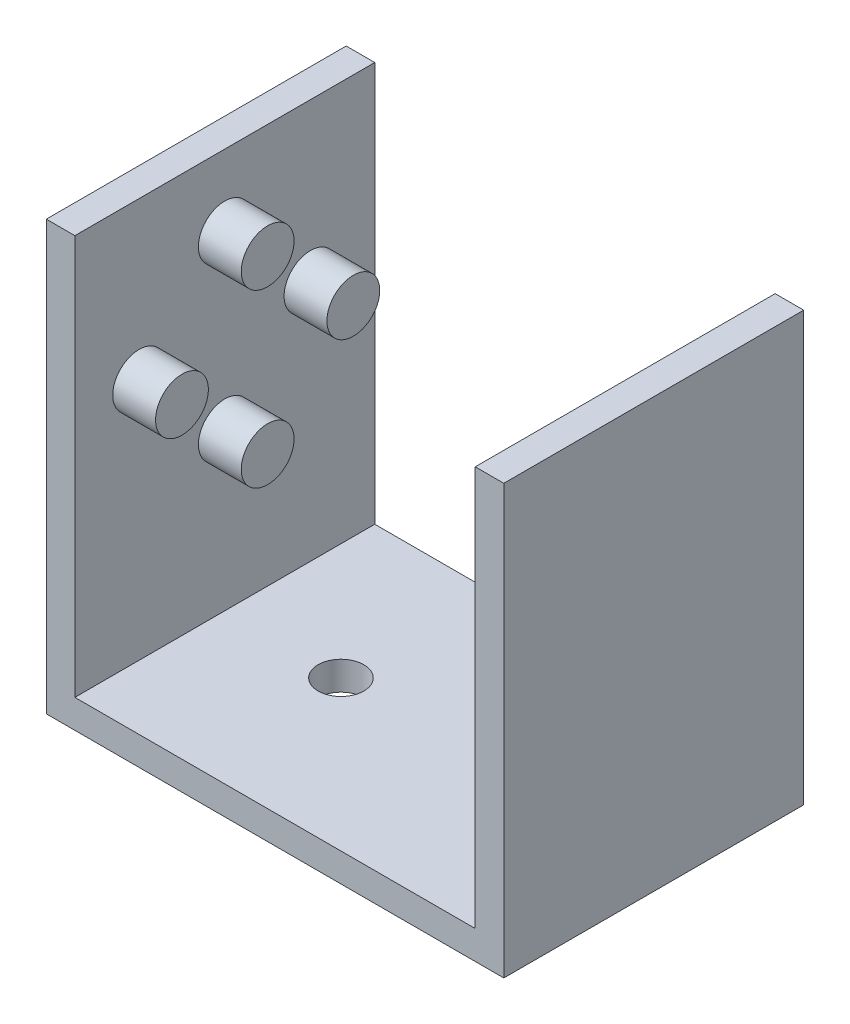
ISO-10303-21;
HEADER;
FILE_DESCRIPTION(('STEP AP214'),'2;1');
FILE_NAME('part.step','',(''),(''),'','','');
FILE_SCHEMA(('AUTOMOTIVE_DESIGN { 1 0 10303 214 1 1 1 1 }'));
ENDSEC;
DATA;
#1=APPLICATION_CONTEXT('core data for automotive mechanical design processes');
#2=APPLICATION_PROTOCOL_DEFINITION('international standard','automotive_design',2000,#1);
#3=PRODUCT_CONTEXT('',#1,'mechanical');
#4=PRODUCT('Part','Part','',(#3));
#5=PRODUCT_RELATED_PRODUCT_CATEGORY('part','',(#4));
#6=PRODUCT_DEFINITION_FORMATION('','',#4);
#7=PRODUCT_DEFINITION_CONTEXT('part definition',#1,'design');
#8=PRODUCT_DEFINITION('design','',#6,#7);
#9=PRODUCT_DEFINITION_SHAPE('','',#8);
#10=(LENGTH_UNIT() NAMED_UNIT(*) SI_UNIT(.MILLI.,.METRE.));
#11=(NAMED_UNIT(*) PLANE_ANGLE_UNIT() SI_UNIT($,.RADIAN.));
#12=(NAMED_UNIT(*) SI_UNIT($,.STERADIAN.) SOLID_ANGLE_UNIT());
#13=UNCERTAINTY_MEASURE_WITH_UNIT(LENGTH_MEASURE(1.E-05),#10,'distance_accuracy_value','');
#14=(GEOMETRIC_REPRESENTATION_CONTEXT(3) GLOBAL_UNCERTAINTY_ASSIGNED_CONTEXT((#13)) GLOBAL_UNIT_ASSIGNED_CONTEXT((#10,
#11,#12)) REPRESENTATION_CONTEXT('',''));
#15=CARTESIAN_POINT('',(0.,0.,0.));
#16=DIRECTION('',(0.,0.,1.));
#17=DIRECTION('',(1.,0.,0.));
#18=AXIS2_PLACEMENT_3D('',#15,#16,#17);
#19=CARTESIAN_POINT('',(9.32069693245083,-19.2948215654397,-10.5));
#20=DIRECTION('',(1.,0.,0.));
#21=DIRECTION('',(0.,1.,0.));
#22=AXIS2_PLACEMENT_3D('',#19,#20,#21);
#23=CYLINDRICAL_SURFACE('',#22,1.85);
#24=CARTESIAN_POINT('',(9.32069693245083,-19.2948215654397,-10.5));
#25=DIRECTION('',(-1.,0.,0.));
#26=DIRECTION('',(0.,-1.,0.));
#27=AXIS2_PLACEMENT_3D('',#24,#25,#26);
#28=CIRCLE('',#27,1.85);
#29=CARTESIAN_POINT('',(9.32069693245083,-21.1448215654397,-10.5));
#30=VERTEX_POINT('',#29);
#31=EDGE_CURVE('E11',#30,#30,#28,.T.);
#32=ORIENTED_EDGE('',*,*,#31,.F.);
#33=EDGE_LOOP('',(#32));
#34=FACE_BOUND('',#33,.T.);
#35=CARTESIAN_POINT('',(12.3206969324508,-19.2948215654397,-10.5));
#36=DIRECTION('',(-1.,0.,0.));
#37=DIRECTION('',(0.,-1.,0.));
#38=AXIS2_PLACEMENT_3D('',#35,#36,#37);
#39=CIRCLE('',#38,1.85);
#40=CARTESIAN_POINT('',(12.3206969324508,-21.1448215654397,-10.5));
#41=VERTEX_POINT('',#40);
#42=EDGE_CURVE('E50',#41,#41,#39,.T.);
#43=ORIENTED_EDGE('',*,*,#42,.T.);
#44=EDGE_LOOP('',(#43));
#45=FACE_BOUND('',#44,.T.);
#46=ADVANCED_FACE('F47',(#34,#45),#23,.T.);
#47=CARTESIAN_POINT('',(9.32069693245083,-19.2948215654397,-10.5));
#48=DIRECTION('',(-1.,0.,0.));
#49=DIRECTION('',(0.,-1.,0.));
#50=AXIS2_PLACEMENT_3D('',#47,#48,#49);
#51=PLANE('',#50);
#52=ORIENTED_EDGE('',*,*,#31,.T.);
#53=EDGE_LOOP('',(#52));
#54=FACE_BOUND('',#53,.T.);
#55=ADVANCED_FACE('F62',(#54),#51,.T.);
#56=CARTESIAN_POINT('',(12.3206969324508,-19.2948215654397,-10.5));
#57=DIRECTION('',(-1.,0.,0.));
#58=DIRECTION('',(0.,-1.,0.));
#59=AXIS2_PLACEMENT_3D('',#56,#57,#58);
#60=PLANE('',#59);
#61=ORIENTED_EDGE('',*,*,#42,.F.);
#62=EDGE_LOOP('',(#61));
#63=FACE_BOUND('',#62,.T.);
#64=ADVANCED_FACE('F60',(#63),#60,.F.);
#65=CLOSED_SHELL('',(#46,#55,#64));
#66=MANIFOLD_SOLID_BREP('B2',#65);
#67=CARTESIAN_POINT('',(12.3206969324508,-36.2948215654397,-21.));
#68=DIRECTION('',(0.,1.,0.));
#69=DIRECTION('',(0.,0.,1.));
#70=AXIS2_PLACEMENT_3D('',#67,#68,#69);
#71=PLANE('',#70);
#72=CARTESIAN_POINT('',(7.41858126283971,-36.2948215654397,-10.5));
#73=DIRECTION('',(0.,1.,0.));
#74=DIRECTION('',(0.,0.,1.));
#75=AXIS2_PLACEMENT_3D('',#72,#73,#74);
#76=CIRCLE('',#75,1.6);
#77=CARTESIAN_POINT('',(7.41858126283971,-36.2948215654397,-8.9));
#78=VERTEX_POINT('',#77);
#79=EDGE_CURVE('E297',#78,#78,#76,.T.);
#80=ORIENTED_EDGE('',*,*,#79,.F.);
#81=EDGE_LOOP('',(#80));
#82=FACE_BOUND('',#81,.T.);
#83=CARTESIAN_POINT('',(-7.58141873716028,-36.2948215654397,-10.5));
#84=DIRECTION('',(0.,1.,0.));
#85=DIRECTION('',(0.,0.,1.));
#86=AXIS2_PLACEMENT_3D('',#83,#84,#85);
#87=CIRCLE('',#86,1.6);
#88=CARTESIAN_POINT('',(-7.58141873716028,-36.2948215654397,-8.9));
#89=VERTEX_POINT('',#88);
#90=EDGE_CURVE('E301',#89,#89,#87,.T.);
#91=ORIENTED_EDGE('',*,*,#90,.F.);
#92=EDGE_LOOP('',(#91));
#93=FACE_BOUND('',#92,.T.);
#94=DIRECTION('',(-1.,0.,0.));
#95=VECTOR('',#94,1.);
#96=CARTESIAN_POINT('',(12.3206969324508,-36.2948215654397,0.));
#97=LINE('',#96,#95);
#98=CARTESIAN_POINT('',(12.3206969324508,-36.2948215654397,0.));
#99=VERTEX_POINT('',#98);
#100=CARTESIAN_POINT('',(-15.7146854023076,-36.2948215654397,0.));
#101=VERTEX_POINT('',#100);
#102=EDGE_CURVE('E191',#99,#101,#97,.T.);
#103=ORIENTED_EDGE('',*,*,#102,.F.);
#104=DIRECTION('',(0.,0.,1.));
#105=VECTOR('',#104,1.);
#106=CARTESIAN_POINT('',(12.3206969324508,-36.2948215654397,-21.));
#107=LINE('',#106,#105);
#108=CARTESIAN_POINT('',(12.3206969324508,-36.2948215654397,-21.));
#109=VERTEX_POINT('',#108);
#110=EDGE_CURVE('E45',#109,#99,#107,.T.);
#111=ORIENTED_EDGE('',*,*,#110,.F.);
#112=DIRECTION('',(-1.,0.,0.));
#113=VECTOR('',#112,1.);
#114=CARTESIAN_POINT('',(12.3206969324508,-36.2948215654397,-21.));
#115=LINE('',#114,#113);
#116=CARTESIAN_POINT('',(-15.7146854023076,-36.2948215654397,-21.));
#117=VERTEX_POINT('',#116);
#118=EDGE_CURVE('E212',#109,#117,#115,.T.);
#119=ORIENTED_EDGE('',*,*,#118,.T.);
#120=DIRECTION('',(0.,0.,1.));
#121=VECTOR('',#120,1.);
#122=CARTESIAN_POINT('',(-15.7146854023076,-36.2948215654397,-21.));
#123=LINE('',#122,#121);
#124=EDGE_CURVE('E97',#117,#101,#123,.T.);
#125=ORIENTED_EDGE('',*,*,#124,.T.);
#126=EDGE_LOOP('',(#103,#111,#119,#125));
#127=FACE_BOUND('',#126,.T.);
#128=ADVANCED_FACE('F94',(#82,#93,#127),#71,.T.);
#129=CARTESIAN_POINT('',(12.3206969324508,-8.29482156543967,-21.));
#130=DIRECTION('',(-1.,0.,0.));
#131=DIRECTION('',(0.,-1.,0.));
#132=AXIS2_PLACEMENT_3D('',#129,#130,#131);
#133=PLANE('',#132);
#134=DIRECTION('',(0.,-1.,0.));
#135=VECTOR('',#134,1.);
#136=CARTESIAN_POINT('',(12.3206969324508,-8.29482156543967,0.));
#137=LINE('',#136,#135);
#138=CARTESIAN_POINT('',(12.3206969324508,-8.29482156543967,0.));
#139=VERTEX_POINT('',#138);
#140=EDGE_CURVE('E210',#139,#99,#137,.T.);
#141=ORIENTED_EDGE('',*,*,#140,.F.);
#142=DIRECTION('',(0.,0.,1.));
#143=VECTOR('',#142,1.);
#144=CARTESIAN_POINT('',(12.3206969324508,-8.29482156543967,-21.));
#145=LINE('',#144,#143);
#146=CARTESIAN_POINT('',(12.3206969324508,-8.29482156543967,-21.));
#147=VERTEX_POINT('',#146);
#148=EDGE_CURVE('E103',#147,#139,#145,.T.);
#149=ORIENTED_EDGE('',*,*,#148,.F.);
#150=DIRECTION('',(0.,-1.,0.));
#151=VECTOR('',#150,1.);
#152=CARTESIAN_POINT('',(12.3206969324508,-8.29482156543967,-21.));
#153=LINE('',#152,#151);
#154=EDGE_CURVE('E181',#147,#109,#153,.T.);
#155=ORIENTED_EDGE('',*,*,#154,.T.);
#156=ORIENTED_EDGE('',*,*,#110,.T.);
#157=EDGE_LOOP('',(#141,#149,#155,#156));
#158=FACE_BOUND('',#157,.T.);
#159=ADVANCED_FACE('F224',(#158),#133,.T.);
#160=CARTESIAN_POINT('',(12.3206969324508,-8.29482156543967,-21.));
#161=DIRECTION('',(0.,1.,0.));
#162=DIRECTION('',(0.,0.,1.));
#163=AXIS2_PLACEMENT_3D('',#160,#161,#162);
#164=PLANE('',#163);
#165=DIRECTION('',(-1.,0.,0.));
#166=VECTOR('',#165,1.);
#167=CARTESIAN_POINT('',(12.3206969324508,-8.29482156543967,0.));
#168=LINE('',#167,#166);
#169=CARTESIAN_POINT('',(14.3206969324508,-8.29482156543967,0.));
#170=VERTEX_POINT('',#169);
#171=EDGE_CURVE('E168',#170,#139,#168,.T.);
#172=ORIENTED_EDGE('',*,*,#171,.F.);
#173=DIRECTION('',(0.,0.,1.));
#174=VECTOR('',#173,1.);
#175=CARTESIAN_POINT('',(14.3206969324508,-8.29482156543967,-21.));
#176=LINE('',#175,#174);
#177=CARTESIAN_POINT('',(14.3206969324508,-8.29482156543967,-21.));
#178=VERTEX_POINT('',#177);
#179=EDGE_CURVE('E163',#178,#170,#176,.T.);
#180=ORIENTED_EDGE('',*,*,#179,.F.);
#181=DIRECTION('',(-1.,0.,0.));
#182=VECTOR('',#181,1.);
#183=CARTESIAN_POINT('',(12.3206969324508,-8.29482156543967,-21.));
#184=LINE('',#183,#182);
#185=EDGE_CURVE('E166',#178,#147,#184,.T.);
#186=ORIENTED_EDGE('',*,*,#185,.T.);
#187=ORIENTED_EDGE('',*,*,#148,.T.);
#188=EDGE_LOOP('',(#172,#180,#186,#187));
#189=FACE_BOUND('',#188,.T.);
#190=ADVANCED_FACE('F165',(#189),#164,.T.);
#191=CARTESIAN_POINT('',(14.3206969324508,-8.29482156543967,-21.));
#192=DIRECTION('',(1.,0.,0.));
#193=DIRECTION('',(0.,1.,0.));
#194=AXIS2_PLACEMENT_3D('',#191,#192,#193);
#195=PLANE('',#194);
#196=DIRECTION('',(0.,1.,0.));
#197=VECTOR('',#196,1.);
#198=CARTESIAN_POINT('',(14.3206969324508,-8.29482156543967,0.));
#199=LINE('',#198,#197);
#200=CARTESIAN_POINT('',(14.3206969324508,-38.2948215654397,0.));
#201=VERTEX_POINT('',#200);
#202=EDGE_CURVE('E207',#201,#170,#199,.T.);
#203=ORIENTED_EDGE('',*,*,#202,.F.);
#204=DIRECTION('',(0.,0.,1.));
#205=VECTOR('',#204,1.);
#206=CARTESIAN_POINT('',(14.3206969324508,-38.2948215654397,-21.));
#207=LINE('',#206,#205);
#208=CARTESIAN_POINT('',(14.3206969324508,-38.2948215654397,-21.));
#209=VERTEX_POINT('',#208);
#210=EDGE_CURVE('E173',#209,#201,#207,.T.);
#211=ORIENTED_EDGE('',*,*,#210,.F.);
#212=DIRECTION('',(0.,1.,0.));
#213=VECTOR('',#212,1.);
#214=CARTESIAN_POINT('',(14.3206969324508,-8.29482156543967,-21.));
#215=LINE('',#214,#213);
#216=EDGE_CURVE('E179',#209,#178,#215,.T.);
#217=ORIENTED_EDGE('',*,*,#216,.T.);
#218=ORIENTED_EDGE('',*,*,#179,.T.);
#219=EDGE_LOOP('',(#203,#211,#217,#218));
#220=FACE_BOUND('',#219,.T.);
#221=ADVANCED_FACE('F183',(#220),#195,.T.);
#222=CARTESIAN_POINT('',(14.3206969324508,-38.2948215654397,-21.));
#223=DIRECTION('',(0.,-1.,0.));
#224=DIRECTION('',(0.,0.,-1.));
#225=AXIS2_PLACEMENT_3D('',#222,#223,#224);
#226=PLANE('',#225);
#227=CARTESIAN_POINT('',(7.41858126283971,-38.2948215654397,-10.5));
#228=DIRECTION('',(0.,-1.,0.));
#229=DIRECTION('',(0.,0.,-1.));
#230=AXIS2_PLACEMENT_3D('',#227,#228,#229);
#231=CIRCLE('',#230,1.6);
#232=CARTESIAN_POINT('',(7.41858126283971,-38.2948215654397,-12.1));
#233=VERTEX_POINT('',#232);
#234=EDGE_CURVE('E304',#233,#233,#231,.T.);
#235=ORIENTED_EDGE('',*,*,#234,.F.);
#236=EDGE_LOOP('',(#235));
#237=FACE_BOUND('',#236,.T.);
#238=CARTESIAN_POINT('',(-7.58141873716028,-38.2948215654397,-10.5));
#239=DIRECTION('',(0.,-1.,0.));
#240=DIRECTION('',(0.,0.,1.));
#241=AXIS2_PLACEMENT_3D('',#238,#239,#240);
#242=CIRCLE('',#241,1.6);
#243=CARTESIAN_POINT('',(-7.58141873716028,-38.2948215654397,-8.9));
#244=VERTEX_POINT('',#243);
#245=EDGE_CURVE('E305',#244,#244,#242,.T.);
#246=ORIENTED_EDGE('',*,*,#245,.F.);
#247=EDGE_LOOP('',(#246));
#248=FACE_BOUND('',#247,.T.);
#249=DIRECTION('',(1.,0.,0.));
#250=VECTOR('',#249,1.);
#251=CARTESIAN_POINT('',(14.3206969324508,-38.2948215654397,0.));
#252=LINE('',#251,#250);
#253=CARTESIAN_POINT('',(-17.7146854023076,-38.2948215654397,0.));
#254=VERTEX_POINT('',#253);
#255=EDGE_CURVE('E204',#254,#201,#252,.T.);
#256=ORIENTED_EDGE('',*,*,#255,.F.);
#257=DIRECTION('',(0.,0.,1.));
#258=VECTOR('',#257,1.);
#259=CARTESIAN_POINT('',(-17.7146854023076,-38.2948215654397,-21.));
#260=LINE('',#259,#258);
#261=CARTESIAN_POINT('',(-17.7146854023076,-38.2948215654397,-21.));
#262=VERTEX_POINT('',#261);
#263=EDGE_CURVE('E216',#262,#254,#260,.T.);
#264=ORIENTED_EDGE('',*,*,#263,.F.);
#265=DIRECTION('',(1.,0.,0.));
#266=VECTOR('',#265,1.);
#267=CARTESIAN_POINT('',(14.3206969324508,-38.2948215654397,-21.));
#268=LINE('',#267,#266);
#269=EDGE_CURVE('E184',#262,#209,#268,.T.);
#270=ORIENTED_EDGE('',*,*,#269,.T.);
#271=ORIENTED_EDGE('',*,*,#210,.T.);
#272=EDGE_LOOP('',(#256,#264,#270,#271));
#273=FACE_BOUND('',#272,.T.);
#274=ADVANCED_FACE('F238',(#237,#248,#273),#226,.T.);
#275=CARTESIAN_POINT('',(-17.7146854023076,-38.2948215654397,-21.));
#276=DIRECTION('',(-1.,0.,0.));
#277=DIRECTION('',(0.,0.,1.));
#278=AXIS2_PLACEMENT_3D('',#275,#276,#277);
#279=PLANE('',#278);
#280=DIRECTION('',(0.,-1.,0.));
#281=VECTOR('',#280,1.);
#282=CARTESIAN_POINT('',(-17.7146854023076,-38.2948215654397,0.));
#283=LINE('',#282,#281);
#284=CARTESIAN_POINT('',(-17.7146854023076,-8.29482156543968,0.));
#285=VERTEX_POINT('',#284);
#286=EDGE_CURVE('E201',#285,#254,#283,.T.);
#287=ORIENTED_EDGE('',*,*,#286,.F.);
#288=DIRECTION('',(0.,0.,1.));
#289=VECTOR('',#288,1.);
#290=CARTESIAN_POINT('',(-17.7146854023076,-8.29482156543968,-21.));
#291=LINE('',#290,#289);
#292=CARTESIAN_POINT('',(-17.7146854023076,-8.29482156543968,-21.));
#293=VERTEX_POINT('',#292);
#294=EDGE_CURVE('E218',#293,#285,#291,.T.);
#295=ORIENTED_EDGE('',*,*,#294,.F.);
#296=DIRECTION('',(0.,-1.,0.));
#297=VECTOR('',#296,1.);
#298=CARTESIAN_POINT('',(-17.7146854023076,-38.2948215654397,-21.));
#299=LINE('',#298,#297);
#300=EDGE_CURVE('E186',#293,#262,#299,.T.);
#301=ORIENTED_EDGE('',*,*,#300,.T.);
#302=ORIENTED_EDGE('',*,*,#263,.T.);
#303=EDGE_LOOP('',(#287,#295,#301,#302));
#304=FACE_BOUND('',#303,.T.);
#305=ADVANCED_FACE('F241',(#304),#279,.T.);
#306=CARTESIAN_POINT('',(-17.7146854023076,-8.29482156543968,-21.));
#307=DIRECTION('',(0.,1.,0.));
#308=DIRECTION('',(-1.,0.,0.));
#309=AXIS2_PLACEMENT_3D('',#306,#307,#308);
#310=PLANE('',#309);
#311=DIRECTION('',(-1.,0.,0.));
#312=VECTOR('',#311,1.);
#313=CARTESIAN_POINT('',(-17.7146854023076,-8.29482156543968,0.));
#314=LINE('',#313,#312);
#315=CARTESIAN_POINT('',(-15.7146854023076,-8.29482156543967,0.));
#316=VERTEX_POINT('',#315);
#317=EDGE_CURVE('E198',#316,#285,#314,.T.);
#318=ORIENTED_EDGE('',*,*,#317,.F.);
#319=DIRECTION('',(0.,0.,1.));
#320=VECTOR('',#319,1.);
#321=CARTESIAN_POINT('',(-15.7146854023076,-8.29482156543967,-21.));
#322=LINE('',#321,#320);
#323=CARTESIAN_POINT('',(-15.7146854023076,-8.29482156543967,-21.));
#324=VERTEX_POINT('',#323);
#325=EDGE_CURVE('E219',#324,#316,#322,.T.);
#326=ORIENTED_EDGE('',*,*,#325,.F.);
#327=DIRECTION('',(-1.,0.,0.));
#328=VECTOR('',#327,1.);
#329=CARTESIAN_POINT('',(-17.7146854023076,-8.29482156543968,-21.));
#330=LINE('',#329,#328);
#331=EDGE_CURVE('E280',#324,#293,#330,.T.);
#332=ORIENTED_EDGE('',*,*,#331,.T.);
#333=ORIENTED_EDGE('',*,*,#294,.T.);
#334=EDGE_LOOP('',(#318,#326,#332,#333));
#335=FACE_BOUND('',#334,.T.);
#336=ADVANCED_FACE('F245',(#335),#310,.T.);
#337=CARTESIAN_POINT('',(-15.7146854023076,-36.2948215654397,-21.));
#338=DIRECTION('',(1.,0.,0.));
#339=DIRECTION('',(0.,1.,0.));
#340=AXIS2_PLACEMENT_3D('',#337,#338,#339);
#341=PLANE('',#340);
#342=CARTESIAN_POINT('',(-15.7146854023076,-13.2948215654397,-10.5));
#343=DIRECTION('',(1.,0.,0.));
#344=DIRECTION('',(0.,0.,-1.));
#345=AXIS2_PLACEMENT_3D('',#342,#343,#344);
#346=CIRCLE('',#345,1.85000000000006);
#347=CARTESIAN_POINT('',(-15.7146854023076,-13.2948215654397,-12.3500000000001));
#348=VERTEX_POINT('',#347);
#349=EDGE_CURVE('E257',#348,#348,#346,.T.);
#350=ORIENTED_EDGE('',*,*,#349,.F.);
#351=EDGE_LOOP('',(#350));
#352=FACE_BOUND('',#351,.T.);
#353=CARTESIAN_POINT('',(-15.7146854023076,-19.2948215654397,-4.5));
#354=DIRECTION('',(1.,0.,0.));
#355=DIRECTION('',(0.,0.,-1.));
#356=AXIS2_PLACEMENT_3D('',#353,#354,#355);
#357=CIRCLE('',#356,1.84999999999997);
#358=CARTESIAN_POINT('',(-15.7146854023076,-19.2948215654397,-6.34999999999997));
#359=VERTEX_POINT('',#358);
#360=EDGE_CURVE('E261',#359,#359,#357,.T.);
#361=ORIENTED_EDGE('',*,*,#360,.F.);
#362=EDGE_LOOP('',(#361));
#363=FACE_BOUND('',#362,.T.);
#364=CARTESIAN_POINT('',(-15.7146854023076,-19.2948215654397,-16.5));
#365=DIRECTION('',(1.,0.,0.));
#366=DIRECTION('',(0.,0.,-1.));
#367=AXIS2_PLACEMENT_3D('',#364,#365,#366);
#368=CIRCLE('',#367,1.85000000000005);
#369=CARTESIAN_POINT('',(-15.7146854023076,-19.2948215654397,-18.3500000000001));
#370=VERTEX_POINT('',#369);
#371=EDGE_CURVE('E265',#370,#370,#368,.T.);
#372=ORIENTED_EDGE('',*,*,#371,.F.);
#373=EDGE_LOOP('',(#372));
#374=FACE_BOUND('',#373,.T.);
#375=CARTESIAN_POINT('',(-15.7146854023076,-25.2948215654397,-10.5));
#376=DIRECTION('',(1.,0.,0.));
#377=DIRECTION('',(0.,0.,-1.));
#378=AXIS2_PLACEMENT_3D('',#375,#376,#377);
#379=CIRCLE('',#378,1.85);
#380=CARTESIAN_POINT('',(-15.7146854023076,-25.2948215654397,-12.35));
#381=VERTEX_POINT('',#380);
#382=EDGE_CURVE('E268',#381,#381,#379,.T.);
#383=ORIENTED_EDGE('',*,*,#382,.F.);
#384=EDGE_LOOP('',(#383));
#385=FACE_BOUND('',#384,.T.);
#386=DIRECTION('',(0.,1.,0.));
#387=VECTOR('',#386,1.);
#388=CARTESIAN_POINT('',(-15.7146854023076,-36.2948215654397,0.));
#389=LINE('',#388,#387);
#390=EDGE_CURVE('E194',#101,#316,#389,.T.);
#391=ORIENTED_EDGE('',*,*,#390,.F.);
#392=ORIENTED_EDGE('',*,*,#124,.F.);
#393=DIRECTION('',(0.,1.,0.));
#394=VECTOR('',#393,1.);
#395=CARTESIAN_POINT('',(-15.7146854023076,-36.2948215654397,-21.));
#396=LINE('',#395,#394);
#397=EDGE_CURVE('E278',#117,#324,#396,.T.);
#398=ORIENTED_EDGE('',*,*,#397,.T.);
#399=ORIENTED_EDGE('',*,*,#325,.T.);
#400=EDGE_LOOP('',(#391,#392,#398,#399));
#401=FACE_BOUND('',#400,.T.);
#402=ADVANCED_FACE('F221',(#352,#363,#374,#385,#401),#341,.T.);
#403=CARTESIAN_POINT('',(0.,0.,-21.));
#404=DIRECTION('',(0.,0.,-1.));
#405=DIRECTION('',(-1.,0.,0.));
#406=AXIS2_PLACEMENT_3D('',#403,#404,#405);
#407=PLANE('',#406);
#408=ORIENTED_EDGE('',*,*,#118,.F.);
#409=ORIENTED_EDGE('',*,*,#154,.F.);
#410=ORIENTED_EDGE('',*,*,#185,.F.);
#411=ORIENTED_EDGE('',*,*,#216,.F.);
#412=ORIENTED_EDGE('',*,*,#269,.F.);
#413=ORIENTED_EDGE('',*,*,#300,.F.);
#414=ORIENTED_EDGE('',*,*,#331,.F.);
#415=ORIENTED_EDGE('',*,*,#397,.F.);
#416=EDGE_LOOP('',(#408,#409,#410,#411,#412,#413,#414,#415));
#417=FACE_BOUND('',#416,.T.);
#418=ADVANCED_FACE('F177',(#417),#407,.T.);
#419=CARTESIAN_POINT('',(0.,0.,0.));
#420=DIRECTION('',(0.,0.,-1.));
#421=DIRECTION('',(-1.,0.,0.));
#422=AXIS2_PLACEMENT_3D('',#419,#420,#421);
#423=PLANE('',#422);
#424=ORIENTED_EDGE('',*,*,#102,.T.);
#425=ORIENTED_EDGE('',*,*,#390,.T.);
#426=ORIENTED_EDGE('',*,*,#317,.T.);
#427=ORIENTED_EDGE('',*,*,#286,.T.);
#428=ORIENTED_EDGE('',*,*,#255,.T.);
#429=ORIENTED_EDGE('',*,*,#202,.T.);
#430=ORIENTED_EDGE('',*,*,#171,.T.);
#431=ORIENTED_EDGE('',*,*,#140,.T.);
#432=EDGE_LOOP('',(#424,#425,#426,#427,#428,#429,#430,#431));
#433=FACE_BOUND('',#432,.T.);
#434=ADVANCED_FACE('F223',(#433),#423,.F.);
#435=CARTESIAN_POINT('',(-12.7146854023076,-25.2948215654397,-10.5));
#436=DIRECTION('',(-1.,0.,0.));
#437=DIRECTION('',(0.,0.,1.));
#438=AXIS2_PLACEMENT_3D('',#435,#436,#437);
#439=CYLINDRICAL_SURFACE('',#438,1.85);
#440=CARTESIAN_POINT('',(-12.7146854023076,-25.2948215654397,-10.5));
#441=DIRECTION('',(1.,0.,0.));
#442=DIRECTION('',(0.,0.,-1.));
#443=AXIS2_PLACEMENT_3D('',#440,#441,#442);
#444=CIRCLE('',#443,1.85);
#445=CARTESIAN_POINT('',(-12.7146854023076,-25.2948215654397,-12.35));
#446=VERTEX_POINT('',#445);
#447=EDGE_CURVE('E195',#446,#446,#444,.T.);
#448=ORIENTED_EDGE('',*,*,#447,.F.);
#449=EDGE_LOOP('',(#448));
#450=FACE_BOUND('',#449,.T.);
#451=ORIENTED_EDGE('',*,*,#382,.T.);
#452=EDGE_LOOP('',(#451));
#453=FACE_BOUND('',#452,.T.);
#454=ADVANCED_FACE('F352',(#450,#453),#439,.T.);
#455=CARTESIAN_POINT('',(-12.7146854023076,-25.2948215654397,-10.5));
#456=DIRECTION('',(1.,0.,0.));
#457=DIRECTION('',(0.,0.,-1.));
#458=AXIS2_PLACEMENT_3D('',#455,#456,#457);
#459=PLANE('',#458);
#460=ORIENTED_EDGE('',*,*,#447,.T.);
#461=EDGE_LOOP('',(#460));
#462=FACE_BOUND('',#461,.T.);
#463=ADVANCED_FACE('F345',(#462),#459,.T.);
#464=CARTESIAN_POINT('',(-12.7146854023076,-19.2948215654397,-16.5));
#465=DIRECTION('',(-1.,0.,0.));
#466=DIRECTION('',(0.,0.,1.));
#467=AXIS2_PLACEMENT_3D('',#464,#465,#466);
#468=CYLINDRICAL_SURFACE('',#467,1.85000000000005);
#469=CARTESIAN_POINT('',(-12.7146854023076,-19.2948215654397,-16.5));
#470=DIRECTION('',(1.,0.,0.));
#471=DIRECTION('',(0.,0.,-1.));
#472=AXIS2_PLACEMENT_3D('',#469,#470,#471);
#473=CIRCLE('',#472,1.85000000000005);
#474=CARTESIAN_POINT('',(-12.7146854023076,-19.2948215654397,-18.3500000000001));
#475=VERTEX_POINT('',#474);
#476=EDGE_CURVE('E273',#475,#475,#473,.T.);
#477=ORIENTED_EDGE('',*,*,#476,.F.);
#478=EDGE_LOOP('',(#477));
#479=FACE_BOUND('',#478,.T.);
#480=ORIENTED_EDGE('',*,*,#371,.T.);
#481=EDGE_LOOP('',(#480));
#482=FACE_BOUND('',#481,.T.);
#483=ADVANCED_FACE('F342',(#479,#482),#468,.T.);
#484=CARTESIAN_POINT('',(-12.7146854023076,-19.2948215654397,-16.5));
#485=DIRECTION('',(1.,0.,0.));
#486=DIRECTION('',(0.,0.,-1.));
#487=AXIS2_PLACEMENT_3D('',#484,#485,#486);
#488=PLANE('',#487);
#489=ORIENTED_EDGE('',*,*,#476,.T.);
#490=EDGE_LOOP('',(#489));
#491=FACE_BOUND('',#490,.T.);
#492=ADVANCED_FACE('F337',(#491),#488,.T.);
#493=CARTESIAN_POINT('',(-12.7146854023076,-19.2948215654397,-4.5));
#494=DIRECTION('',(-1.,0.,0.));
#495=DIRECTION('',(0.,0.,1.));
#496=AXIS2_PLACEMENT_3D('',#493,#494,#495);
#497=CYLINDRICAL_SURFACE('',#496,1.84999999999997);
#498=CARTESIAN_POINT('',(-12.7146854023076,-19.2948215654397,-4.5));
#499=DIRECTION('',(1.,0.,0.));
#500=DIRECTION('',(0.,0.,-1.));
#501=AXIS2_PLACEMENT_3D('',#498,#499,#500);
#502=CIRCLE('',#501,1.84999999999997);
#503=CARTESIAN_POINT('',(-12.7146854023076,-19.2948215654397,-6.34999999999997));
#504=VERTEX_POINT('',#503);
#505=EDGE_CURVE('E290',#504,#504,#502,.T.);
#506=ORIENTED_EDGE('',*,*,#505,.F.);
#507=EDGE_LOOP('',(#506));
#508=FACE_BOUND('',#507,.T.);
#509=ORIENTED_EDGE('',*,*,#360,.T.);
#510=EDGE_LOOP('',(#509));
#511=FACE_BOUND('',#510,.T.);
#512=ADVANCED_FACE('F334',(#508,#511),#497,.T.);
#513=CARTESIAN_POINT('',(-12.7146854023076,-19.2948215654397,-4.5));
#514=DIRECTION('',(1.,0.,0.));
#515=DIRECTION('',(0.,0.,-1.));
#516=AXIS2_PLACEMENT_3D('',#513,#514,#515);
#517=PLANE('',#516);
#518=ORIENTED_EDGE('',*,*,#505,.T.);
#519=EDGE_LOOP('',(#518));
#520=FACE_BOUND('',#519,.T.);
#521=ADVANCED_FACE('F331',(#520),#517,.T.);
#522=CARTESIAN_POINT('',(-12.7146854023076,-13.2948215654397,-10.5));
#523=DIRECTION('',(-1.,0.,0.));
#524=DIRECTION('',(0.,0.,1.));
#525=AXIS2_PLACEMENT_3D('',#522,#523,#524);
#526=CYLINDRICAL_SURFACE('',#525,1.85000000000006);
#527=CARTESIAN_POINT('',(-12.7146854023076,-13.2948215654397,-10.5));
#528=DIRECTION('',(1.,0.,0.));
#529=DIRECTION('',(0.,0.,-1.));
#530=AXIS2_PLACEMENT_3D('',#527,#528,#529);
#531=CIRCLE('',#530,1.85000000000006);
#532=CARTESIAN_POINT('',(-12.7146854023076,-13.2948215654397,-12.3500000000001));
#533=VERTEX_POINT('',#532);
#534=EDGE_CURVE('E294',#533,#533,#531,.T.);
#535=ORIENTED_EDGE('',*,*,#534,.F.);
#536=EDGE_LOOP('',(#535));
#537=FACE_BOUND('',#536,.T.);
#538=ORIENTED_EDGE('',*,*,#349,.T.);
#539=EDGE_LOOP('',(#538));
#540=FACE_BOUND('',#539,.T.);
#541=ADVANCED_FACE('F326',(#537,#540),#526,.T.);
#542=CARTESIAN_POINT('',(-12.7146854023076,-13.2948215654397,-10.5));
#543=DIRECTION('',(1.,0.,0.));
#544=DIRECTION('',(0.,0.,-1.));
#545=AXIS2_PLACEMENT_3D('',#542,#543,#544);
#546=PLANE('',#545);
#547=ORIENTED_EDGE('',*,*,#534,.T.);
#548=EDGE_LOOP('',(#547));
#549=FACE_BOUND('',#548,.T.);
#550=ADVANCED_FACE('F317',(#549),#546,.T.);
#551=CARTESIAN_POINT('',(-7.58141873716028,-35.2948215654397,-10.5));
#552=DIRECTION('',(0.,-1.,0.));
#553=DIRECTION('',(0.,0.,-1.));
#554=AXIS2_PLACEMENT_3D('',#551,#552,#553);
#555=CYLINDRICAL_SURFACE('',#554,1.6);
#556=ORIENTED_EDGE('',*,*,#90,.T.);
#557=EDGE_LOOP('',(#556));
#558=FACE_BOUND('',#557,.T.);
#559=ORIENTED_EDGE('',*,*,#245,.T.);
#560=EDGE_LOOP('',(#559));
#561=FACE_BOUND('',#560,.T.);
#562=ADVANCED_FACE('F315',(#558,#561),#555,.F.);
#563=CARTESIAN_POINT('',(7.41858126283971,-35.2948215654397,-10.5));
#564=DIRECTION('',(0.,-1.,0.));
#565=DIRECTION('',(0.,0.,-1.));
#566=AXIS2_PLACEMENT_3D('',#563,#564,#565);
#567=CYLINDRICAL_SURFACE('',#566,1.6);
#568=ORIENTED_EDGE('',*,*,#79,.T.);
#569=EDGE_LOOP('',(#568));
#570=FACE_BOUND('',#569,.T.);
#571=ORIENTED_EDGE('',*,*,#234,.T.);
#572=EDGE_LOOP('',(#571));
#573=FACE_BOUND('',#572,.T.);
#574=ADVANCED_FACE('F311',(#570,#573),#567,.F.);
#575=CLOSED_SHELL('',(#128,#159,#190,#221,#274,#305,#336,#402,#418,#434,#454,#463,#483,#492,
#512,#521,#541,#550,#562,#574));
#576=MANIFOLD_SOLID_BREP('B6',#575);
#577=ADVANCED_BREP_SHAPE_REPRESENTATION('',(#18,#66,#576),#14);
#578=SHAPE_DEFINITION_REPRESENTATION(#9,#577);
ENDSEC;
END-ISO-10303-21;
